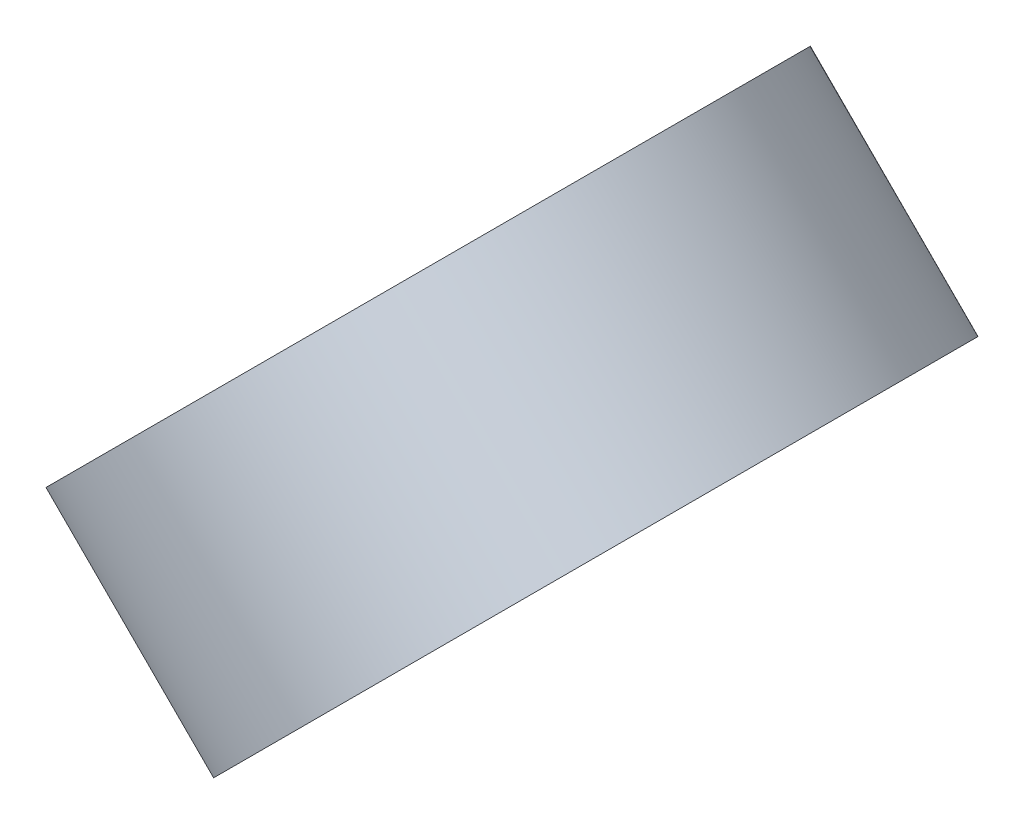
ISO-10303-21;
HEADER;
FILE_DESCRIPTION(('STEP AP214'),'2;1');
FILE_NAME('part.step','',(''),(''),'','','');
FILE_SCHEMA(('AUTOMOTIVE_DESIGN { 1 0 10303 214 1 1 1 1 }'));
ENDSEC;
DATA;
#1=APPLICATION_CONTEXT('core data for automotive mechanical design processes');
#2=APPLICATION_PROTOCOL_DEFINITION('international standard','automotive_design',2000,#1);
#3=PRODUCT_CONTEXT('',#1,'mechanical');
#4=PRODUCT('Part','Part','',(#3));
#5=PRODUCT_RELATED_PRODUCT_CATEGORY('part','',(#4));
#6=PRODUCT_DEFINITION_FORMATION('','',#4);
#7=PRODUCT_DEFINITION_CONTEXT('part definition',#1,'design');
#8=PRODUCT_DEFINITION('design','',#6,#7);
#9=PRODUCT_DEFINITION_SHAPE('','',#8);
#10=(LENGTH_UNIT() NAMED_UNIT(*) SI_UNIT(.MILLI.,.METRE.));
#11=(NAMED_UNIT(*) PLANE_ANGLE_UNIT() SI_UNIT($,.RADIAN.));
#12=(NAMED_UNIT(*) SI_UNIT($,.STERADIAN.) SOLID_ANGLE_UNIT());
#13=UNCERTAINTY_MEASURE_WITH_UNIT(LENGTH_MEASURE(1.E-05),#10,'distance_accuracy_value','');
#14=(GEOMETRIC_REPRESENTATION_CONTEXT(3) GLOBAL_UNCERTAINTY_ASSIGNED_CONTEXT((#13)) GLOBAL_UNIT_ASSIGNED_CONTEXT((#10,
#11,#12)) REPRESENTATION_CONTEXT('',''));
#15=CARTESIAN_POINT('',(0.,0.,0.));
#16=DIRECTION('',(0.,0.,1.));
#17=DIRECTION('',(1.,0.,0.));
#18=AXIS2_PLACEMENT_3D('',#15,#16,#17);
#19=CARTESIAN_POINT('',(13.4254829009966,-13.4254829009987,-47.6815));
#20=DIRECTION('',(-0.707106781186549,0.707106781186547,0.));
#21=DIRECTION('',(0.429407363893136,0.429407363893137,0.794492688241178));
#22=AXIS2_PLACEMENT_3D('',#19,#20,#21);
#23=CYLINDRICAL_SURFACE('',#22,42.545);
#24=CARTESIAN_POINT('',(13.4254829009966,-13.4254829009987,-47.6815));
#25=DIRECTION('',(0.707106781186549,-0.707106781186547,0.));
#26=DIRECTION('',(-0.429407363893136,-0.429407363893137,-0.794492688241178));
#27=AXIS2_PLACEMENT_3D('',#24,#25,#26);
#28=CIRCLE('',#27,42.545);
#29=CARTESIAN_POINT('',(-4.84365339583691,-31.6946191978322,-81.4831914212209));
#30=VERTEX_POINT('',#29);
#31=EDGE_CURVE('E33',#30,#30,#28,.T.);
#32=ORIENTED_EDGE('',*,*,#31,.T.);
#33=EDGE_LOOP('',(#32));
#34=FACE_BOUND('',#33,.T.);
#35=CARTESIAN_POINT('',(-13.5152854622109,13.5152854622087,-47.6815));
#36=DIRECTION('',(0.707106781186549,-0.707106781186547,0.));
#37=DIRECTION('',(-0.429407363893136,-0.429407363893137,-0.794492688241178));
#38=AXIS2_PLACEMENT_3D('',#35,#36,#37);
#39=CIRCLE('',#38,42.545);
#40=CARTESIAN_POINT('',(-31.7844217590444,-4.75385083462479,-81.4831914212209));
#41=VERTEX_POINT('',#40);
#42=EDGE_CURVE('E31',#41,#41,#39,.T.);
#43=ORIENTED_EDGE('',*,*,#42,.F.);
#44=EDGE_LOOP('',(#43));
#45=FACE_BOUND('',#44,.T.);
#46=ADVANCED_FACE('F15',(#34,#45),#23,.F.);
#47=CARTESIAN_POINT('',(13.4254829009966,-13.4254829009987,-47.6815));
#48=DIRECTION('',(0.707106781186549,-0.707106781186547,0.));
#49=DIRECTION('',(-0.429407363893136,-0.429407363893137,-0.794492688241178));
#50=AXIS2_PLACEMENT_3D('',#47,#48,#49);
#51=PLANE('',#50);
#52=CARTESIAN_POINT('',(13.4254829009966,-13.4254829009987,-47.6815));
#53=DIRECTION('',(-0.707106781186549,0.707106781186547,0.));
#54=DIRECTION('',(-0.429407363893136,-0.429407363893137,-0.794492688241178));
#55=AXIS2_PLACEMENT_3D('',#52,#53,#54);
#56=CIRCLE('',#55,50.165);
#57=CARTESIAN_POINT('',(-8.11573750870261,-34.9667033106979,-87.5372257056187));
#58=VERTEX_POINT('',#57);
#59=EDGE_CURVE('E19',#58,#58,#56,.T.);
#60=ORIENTED_EDGE('',*,*,#59,.F.);
#61=EDGE_LOOP('',(#60));
#62=FACE_BOUND('',#61,.T.);
#63=ORIENTED_EDGE('',*,*,#31,.F.);
#64=EDGE_LOOP('',(#63));
#65=FACE_BOUND('',#64,.T.);
#66=ADVANCED_FACE('F44',(#62,#65),#51,.T.);
#67=CARTESIAN_POINT('',(-13.5152854622109,13.5152854622087,-47.6815));
#68=DIRECTION('',(0.707106781186549,-0.707106781186547,0.));
#69=DIRECTION('',(-0.429407363893136,-0.429407363893137,-0.794492688241178));
#70=AXIS2_PLACEMENT_3D('',#67,#68,#69);
#71=PLANE('',#70);
#72=CARTESIAN_POINT('',(-13.5152854622109,13.5152854622087,-47.6815));
#73=DIRECTION('',(0.707106781186549,-0.707106781186547,0.));
#74=DIRECTION('',(-0.429407363893136,-0.429407363893137,-0.794492688241178));
#75=AXIS2_PLACEMENT_3D('',#72,#73,#74);
#76=CIRCLE('',#75,50.165);
#77=CARTESIAN_POINT('',(-35.0565058719101,-8.0259349474905,-87.5372257056187));
#78=VERTEX_POINT('',#77);
#79=EDGE_CURVE('E10',#78,#78,#76,.T.);
#80=ORIENTED_EDGE('',*,*,#79,.F.);
#81=EDGE_LOOP('',(#80));
#82=FACE_BOUND('',#81,.T.);
#83=ORIENTED_EDGE('',*,*,#42,.T.);
#84=EDGE_LOOP('',(#83));
#85=FACE_BOUND('',#84,.T.);
#86=ADVANCED_FACE('F41',(#82,#85),#71,.F.);
#87=CARTESIAN_POINT('',(13.4254829009966,-13.4254829009987,-47.6815));
#88=DIRECTION('',(-0.707106781186549,0.707106781186547,0.));
#89=DIRECTION('',(0.429407363893136,0.429407363893137,0.794492688241178));
#90=AXIS2_PLACEMENT_3D('',#87,#88,#89);
#91=CYLINDRICAL_SURFACE('',#90,50.165);
#92=ORIENTED_EDGE('',*,*,#59,.T.);
#93=EDGE_LOOP('',(#92));
#94=FACE_BOUND('',#93,.T.);
#95=ORIENTED_EDGE('',*,*,#79,.T.);
#96=EDGE_LOOP('',(#95));
#97=FACE_BOUND('',#96,.T.);
#98=ADVANCED_FACE('F17',(#94,#97),#91,.T.);
#99=CLOSED_SHELL('',(#46,#66,#86,#98));
#100=MANIFOLD_SOLID_BREP('B1',#99);
#101=ADVANCED_BREP_SHAPE_REPRESENTATION('',(#18,#100),#14);
#102=SHAPE_DEFINITION_REPRESENTATION(#9,#101);
ENDSEC;
END-ISO-10303-21;
